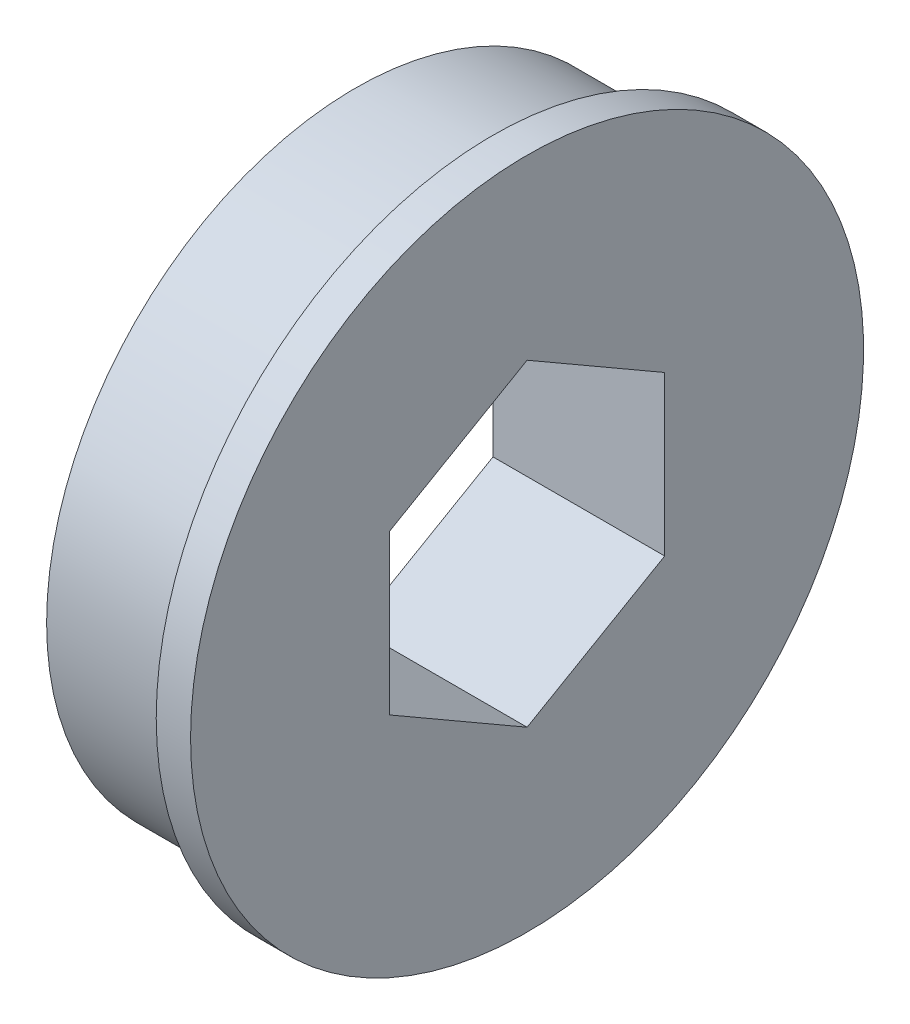
ISO-10303-21;
HEADER;
FILE_DESCRIPTION(('STEP AP214'),'2;1');
FILE_NAME('part.step','',(''),(''),'','','');
FILE_SCHEMA(('AUTOMOTIVE_DESIGN { 1 0 10303 214 1 1 1 1 }'));
ENDSEC;
DATA;
#1=APPLICATION_CONTEXT('core data for automotive mechanical design processes');
#2=APPLICATION_PROTOCOL_DEFINITION('international standard','automotive_design',2000,#1);
#3=PRODUCT_CONTEXT('',#1,'mechanical');
#4=PRODUCT('Part','Part','',(#3));
#5=PRODUCT_RELATED_PRODUCT_CATEGORY('part','',(#4));
#6=PRODUCT_DEFINITION_FORMATION('','',#4);
#7=PRODUCT_DEFINITION_CONTEXT('part definition',#1,'design');
#8=PRODUCT_DEFINITION('design','',#6,#7);
#9=PRODUCT_DEFINITION_SHAPE('','',#8);
#10=(LENGTH_UNIT() NAMED_UNIT(*) SI_UNIT(.MILLI.,.METRE.));
#11=(NAMED_UNIT(*) PLANE_ANGLE_UNIT() SI_UNIT($,.RADIAN.));
#12=(NAMED_UNIT(*) SI_UNIT($,.STERADIAN.) SOLID_ANGLE_UNIT());
#13=UNCERTAINTY_MEASURE_WITH_UNIT(LENGTH_MEASURE(1.E-05),#10,'distance_accuracy_value','');
#14=(GEOMETRIC_REPRESENTATION_CONTEXT(3) GLOBAL_UNCERTAINTY_ASSIGNED_CONTEXT((#13)) GLOBAL_UNIT_ASSIGNED_CONTEXT((#10,
#11,#12)) REPRESENTATION_CONTEXT('',''));
#15=CARTESIAN_POINT('',(0.,0.,0.));
#16=DIRECTION('',(0.,0.,1.));
#17=DIRECTION('',(1.,0.,0.));
#18=AXIS2_PLACEMENT_3D('',#15,#16,#17);
#19=CARTESIAN_POINT('',(-1.5875,0.,0.));
#20=DIRECTION('',(1.,0.,0.));
#21=DIRECTION('',(0.,0.,-1.));
#22=AXIS2_PLACEMENT_3D('',#19,#20,#21);
#23=PLANE('',#22);
#24=CARTESIAN_POINT('',(-1.5875,0.,0.));
#25=DIRECTION('',(-1.,0.,0.));
#26=DIRECTION('',(0.,0.,1.));
#27=AXIS2_PLACEMENT_3D('',#24,#25,#26);
#28=CIRCLE('',#27,14.2748);
#29=CARTESIAN_POINT('',(-1.5875,0.,14.2748));
#30=VERTEX_POINT('',#29);
#31=EDGE_CURVE('E11',#30,#30,#28,.T.);
#32=ORIENTED_EDGE('',*,*,#31,.T.);
#33=EDGE_LOOP('',(#32));
#34=FACE_BOUND('',#33,.T.);
#35=DIRECTION('',(0.,0.5,-0.866025403784439));
#36=VECTOR('',#35,1.);
#37=CARTESIAN_POINT('',(-1.5875,-5.51025983665925,-3.18135));
#38=LINE('',#37,#36);
#39=CARTESIAN_POINT('',(-1.5875,-7.34701311554566,0.));
#40=VERTEX_POINT('',#39);
#41=CARTESIAN_POINT('',(-1.5875,-3.67350655777283,-6.3627));
#42=VERTEX_POINT('',#41);
#43=EDGE_CURVE('E149',#40,#42,#38,.T.);
#44=ORIENTED_EDGE('',*,*,#43,.T.);
#45=DIRECTION('',(0.,1.,0.));
#46=VECTOR('',#45,1.);
#47=CARTESIAN_POINT('',(-1.5875,0.,-6.3627));
#48=LINE('',#47,#46);
#49=CARTESIAN_POINT('',(-1.5875,3.67350655777283,-6.3627));
#50=VERTEX_POINT('',#49);
#51=EDGE_CURVE('E152',#42,#50,#48,.T.);
#52=ORIENTED_EDGE('',*,*,#51,.T.);
#53=DIRECTION('',(0.,0.5,0.866025403784439));
#54=VECTOR('',#53,1.);
#55=CARTESIAN_POINT('',(-1.5875,5.51025983665925,-3.18135));
#56=LINE('',#55,#54);
#57=CARTESIAN_POINT('',(-1.5875,7.34701311554566,0.));
#58=VERTEX_POINT('',#57);
#59=EDGE_CURVE('E139',#50,#58,#56,.T.);
#60=ORIENTED_EDGE('',*,*,#59,.T.);
#61=DIRECTION('',(0.,-0.5,0.866025403784439));
#62=VECTOR('',#61,1.);
#63=CARTESIAN_POINT('',(-1.5875,5.51025983665925,3.18135));
#64=LINE('',#63,#62);
#65=CARTESIAN_POINT('',(-1.5875,3.67350655777283,6.3627));
#66=VERTEX_POINT('',#65);
#67=EDGE_CURVE('E110',#58,#66,#64,.T.);
#68=ORIENTED_EDGE('',*,*,#67,.T.);
#69=DIRECTION('',(0.,-1.,0.));
#70=VECTOR('',#69,1.);
#71=CARTESIAN_POINT('',(-1.5875,0.,6.3627));
#72=LINE('',#71,#70);
#73=CARTESIAN_POINT('',(-1.5875,-3.67350655777283,6.3627));
#74=VERTEX_POINT('',#73);
#75=EDGE_CURVE('E143',#66,#74,#72,.T.);
#76=ORIENTED_EDGE('',*,*,#75,.T.);
#77=DIRECTION('',(0.,-0.5,-0.866025403784439));
#78=VECTOR('',#77,1.);
#79=CARTESIAN_POINT('',(-1.5875,-5.51025983665925,3.18135));
#80=LINE('',#79,#78);
#81=EDGE_CURVE('E146',#74,#40,#80,.T.);
#82=ORIENTED_EDGE('',*,*,#81,.T.);
#83=EDGE_LOOP('',(#44,#52,#60,#68,#76,#82));
#84=FACE_BOUND('',#83,.T.);
#85=ADVANCED_FACE('F45',(#34,#84),#23,.F.);
#86=CARTESIAN_POINT('',(6.35,0.,0.));
#87=DIRECTION('',(-1.,0.,0.));
#88=DIRECTION('',(0.,0.,1.));
#89=AXIS2_PLACEMENT_3D('',#86,#87,#88);
#90=PLANE('',#89);
#91=CARTESIAN_POINT('',(6.35,0.,0.));
#92=DIRECTION('',(-1.,0.,0.));
#93=DIRECTION('',(0.,0.,1.));
#94=AXIS2_PLACEMENT_3D('',#91,#92,#93);
#95=CIRCLE('',#94,15.5575);
#96=CARTESIAN_POINT('',(6.35,0.,15.5575));
#97=VERTEX_POINT('',#96);
#98=EDGE_CURVE('E53',#97,#97,#95,.T.);
#99=ORIENTED_EDGE('',*,*,#98,.F.);
#100=EDGE_LOOP('',(#99));
#101=FACE_BOUND('',#100,.T.);
#102=DIRECTION('',(0.,0.5,0.866025403784439));
#103=VECTOR('',#102,1.);
#104=CARTESIAN_POINT('',(6.35,3.67350655777283,-6.3627));
#105=LINE('',#104,#103);
#106=CARTESIAN_POINT('',(6.35,3.67350655777283,-6.3627));
#107=VERTEX_POINT('',#106);
#108=CARTESIAN_POINT('',(6.35,7.34701311554567,0.));
#109=VERTEX_POINT('',#108);
#110=EDGE_CURVE('E112',#107,#109,#105,.T.);
#111=ORIENTED_EDGE('',*,*,#110,.F.);
#112=DIRECTION('',(0.,1.,0.));
#113=VECTOR('',#112,1.);
#114=CARTESIAN_POINT('',(6.35,-3.67350655777283,-6.3627));
#115=LINE('',#114,#113);
#116=CARTESIAN_POINT('',(6.35,-3.67350655777283,-6.3627));
#117=VERTEX_POINT('',#116);
#118=EDGE_CURVE('E68',#117,#107,#115,.T.);
#119=ORIENTED_EDGE('',*,*,#118,.F.);
#120=DIRECTION('',(0.,0.5,-0.866025403784439));
#121=VECTOR('',#120,1.);
#122=CARTESIAN_POINT('',(6.35,-7.34701311554566,0.));
#123=LINE('',#122,#121);
#124=CARTESIAN_POINT('',(6.35,-7.34701311554566,0.));
#125=VERTEX_POINT('',#124);
#126=EDGE_CURVE('E136',#125,#117,#123,.T.);
#127=ORIENTED_EDGE('',*,*,#126,.F.);
#128=DIRECTION('',(0.,-0.5,-0.866025403784439));
#129=VECTOR('',#128,1.);
#130=CARTESIAN_POINT('',(6.35,-3.67350655777283,6.3627));
#131=LINE('',#130,#129);
#132=CARTESIAN_POINT('',(6.35,-3.67350655777283,6.3627));
#133=VERTEX_POINT('',#132);
#134=EDGE_CURVE('E279',#133,#125,#131,.T.);
#135=ORIENTED_EDGE('',*,*,#134,.F.);
#136=DIRECTION('',(0.,-1.,0.));
#137=VECTOR('',#136,1.);
#138=CARTESIAN_POINT('',(6.35,3.67350655777283,6.3627));
#139=LINE('',#138,#137);
#140=CARTESIAN_POINT('',(6.35,3.67350655777283,6.3627));
#141=VERTEX_POINT('',#140);
#142=EDGE_CURVE('E123',#141,#133,#139,.T.);
#143=ORIENTED_EDGE('',*,*,#142,.F.);
#144=DIRECTION('',(0.,-0.5,0.866025403784439));
#145=VECTOR('',#144,1.);
#146=CARTESIAN_POINT('',(6.35,7.34701311554567,0.));
#147=LINE('',#146,#145);
#148=EDGE_CURVE('E107',#109,#141,#147,.T.);
#149=ORIENTED_EDGE('',*,*,#148,.F.);
#150=EDGE_LOOP('',(#111,#119,#127,#135,#143,#149));
#151=FACE_BOUND('',#150,.T.);
#152=ADVANCED_FACE('F120',(#101,#151),#90,.F.);
#153=CARTESIAN_POINT('',(-6.35,0.,0.));
#154=DIRECTION('',(-1.,0.,0.));
#155=DIRECTION('',(0.,0.,1.));
#156=AXIS2_PLACEMENT_3D('',#153,#154,#155);
#157=CYLINDRICAL_SURFACE('',#156,14.2748);
#158=ORIENTED_EDGE('',*,*,#31,.F.);
#159=EDGE_LOOP('',(#158));
#160=FACE_BOUND('',#159,.T.);
#161=CARTESIAN_POINT('',(4.7625,0.,0.));
#162=DIRECTION('',(-1.,0.,0.));
#163=DIRECTION('',(0.,0.,1.));
#164=AXIS2_PLACEMENT_3D('',#161,#162,#163);
#165=CIRCLE('',#164,14.2748);
#166=CARTESIAN_POINT('',(4.7625,0.,14.2748));
#167=VERTEX_POINT('',#166);
#168=EDGE_CURVE('E155',#167,#167,#165,.T.);
#169=ORIENTED_EDGE('',*,*,#168,.T.);
#170=EDGE_LOOP('',(#169));
#171=FACE_BOUND('',#170,.T.);
#172=ADVANCED_FACE('F47',(#160,#171),#157,.T.);
#173=CARTESIAN_POINT('',(-6.35,0.,0.));
#174=DIRECTION('',(-1.,0.,0.));
#175=DIRECTION('',(0.,0.,1.));
#176=AXIS2_PLACEMENT_3D('',#173,#174,#175);
#177=CYLINDRICAL_SURFACE('',#176,15.5575);
#178=CARTESIAN_POINT('',(4.7625,0.,0.));
#179=DIRECTION('',(-1.,0.,0.));
#180=DIRECTION('',(0.,0.,1.));
#181=AXIS2_PLACEMENT_3D('',#178,#179,#180);
#182=CIRCLE('',#181,15.5575);
#183=CARTESIAN_POINT('',(4.7625,0.,15.5575));
#184=VERTEX_POINT('',#183);
#185=EDGE_CURVE('E158',#184,#184,#182,.T.);
#186=ORIENTED_EDGE('',*,*,#185,.F.);
#187=EDGE_LOOP('',(#186));
#188=FACE_BOUND('',#187,.T.);
#189=ORIENTED_EDGE('',*,*,#98,.T.);
#190=EDGE_LOOP('',(#189));
#191=FACE_BOUND('',#190,.T.);
#192=ADVANCED_FACE('F163',(#188,#191),#177,.T.);
#193=CARTESIAN_POINT('',(4.7625,0.,0.));
#194=DIRECTION('',(1.,0.,0.));
#195=DIRECTION('',(0.,0.,-1.));
#196=AXIS2_PLACEMENT_3D('',#193,#194,#195);
#197=PLANE('',#196);
#198=ORIENTED_EDGE('',*,*,#168,.F.);
#199=EDGE_LOOP('',(#198));
#200=FACE_BOUND('',#199,.T.);
#201=ORIENTED_EDGE('',*,*,#185,.T.);
#202=EDGE_LOOP('',(#201));
#203=FACE_BOUND('',#202,.T.);
#204=ADVANCED_FACE('F176',(#200,#203),#197,.F.);
#205=CARTESIAN_POINT('',(-6.35,-3.67350655777283,-6.3627));
#206=DIRECTION('',(0.,0.,-1.));
#207=DIRECTION('',(0.,-1.,0.));
#208=AXIS2_PLACEMENT_3D('',#205,#206,#207);
#209=PLANE('',#208);
#210=ORIENTED_EDGE('',*,*,#51,.F.);
#211=DIRECTION('',(1.,0.,0.));
#212=VECTOR('',#211,1.);
#213=CARTESIAN_POINT('',(-6.35,-3.67350655777283,-6.3627));
#214=LINE('',#213,#212);
#215=EDGE_CURVE('E135',#42,#117,#214,.T.);
#216=ORIENTED_EDGE('',*,*,#215,.T.);
#217=ORIENTED_EDGE('',*,*,#118,.T.);
#218=DIRECTION('',(1.,0.,0.));
#219=VECTOR('',#218,1.);
#220=CARTESIAN_POINT('',(-6.35,3.67350655777283,-6.3627));
#221=LINE('',#220,#219);
#222=EDGE_CURVE('E116',#50,#107,#221,.T.);
#223=ORIENTED_EDGE('',*,*,#222,.F.);
#224=EDGE_LOOP('',(#210,#216,#217,#223));
#225=FACE_BOUND('',#224,.T.);
#226=ADVANCED_FACE('F180',(#225),#209,.F.);
#227=CARTESIAN_POINT('',(-6.35,-7.34701311554566,0.));
#228=DIRECTION('',(0.,-0.866025403784439,-0.5));
#229=DIRECTION('',(0.,0.5,-0.866025403784439));
#230=AXIS2_PLACEMENT_3D('',#227,#228,#229);
#231=PLANE('',#230);
#232=ORIENTED_EDGE('',*,*,#43,.F.);
#233=DIRECTION('',(1.,0.,0.));
#234=VECTOR('',#233,1.);
#235=CARTESIAN_POINT('',(-6.35,-7.34701311554566,0.));
#236=LINE('',#235,#234);
#237=EDGE_CURVE('E131',#40,#125,#236,.T.);
#238=ORIENTED_EDGE('',*,*,#237,.T.);
#239=ORIENTED_EDGE('',*,*,#126,.T.);
#240=ORIENTED_EDGE('',*,*,#215,.F.);
#241=EDGE_LOOP('',(#232,#238,#239,#240));
#242=FACE_BOUND('',#241,.T.);
#243=ADVANCED_FACE('F184',(#242),#231,.F.);
#244=CARTESIAN_POINT('',(-6.35,-3.67350655777283,6.3627));
#245=DIRECTION('',(0.,-0.866025403784439,0.5));
#246=DIRECTION('',(-1.,0.,0.));
#247=AXIS2_PLACEMENT_3D('',#244,#245,#246);
#248=PLANE('',#247);
#249=ORIENTED_EDGE('',*,*,#81,.F.);
#250=DIRECTION('',(1.,0.,0.));
#251=VECTOR('',#250,1.);
#252=CARTESIAN_POINT('',(-6.35,-3.67350655777283,6.3627));
#253=LINE('',#252,#251);
#254=EDGE_CURVE('E272',#74,#133,#253,.T.);
#255=ORIENTED_EDGE('',*,*,#254,.T.);
#256=ORIENTED_EDGE('',*,*,#134,.T.);
#257=ORIENTED_EDGE('',*,*,#237,.F.);
#258=EDGE_LOOP('',(#249,#255,#256,#257));
#259=FACE_BOUND('',#258,.T.);
#260=ADVANCED_FACE('F187',(#259),#248,.F.);
#261=CARTESIAN_POINT('',(-6.35,3.67350655777283,6.3627));
#262=DIRECTION('',(0.,0.,1.));
#263=DIRECTION('',(1.,0.,0.));
#264=AXIS2_PLACEMENT_3D('',#261,#262,#263);
#265=PLANE('',#264);
#266=ORIENTED_EDGE('',*,*,#75,.F.);
#267=DIRECTION('',(1.,0.,0.));
#268=VECTOR('',#267,1.);
#269=CARTESIAN_POINT('',(-6.35,3.67350655777283,6.3627));
#270=LINE('',#269,#268);
#271=EDGE_CURVE('E125',#66,#141,#270,.T.);
#272=ORIENTED_EDGE('',*,*,#271,.T.);
#273=ORIENTED_EDGE('',*,*,#142,.T.);
#274=ORIENTED_EDGE('',*,*,#254,.F.);
#275=EDGE_LOOP('',(#266,#272,#273,#274));
#276=FACE_BOUND('',#275,.T.);
#277=ADVANCED_FACE('F191',(#276),#265,.F.);
#278=CARTESIAN_POINT('',(-6.35,7.34701311554567,0.));
#279=DIRECTION('',(0.,0.866025403784439,0.5));
#280=DIRECTION('',(1.,0.,0.));
#281=AXIS2_PLACEMENT_3D('',#278,#279,#280);
#282=PLANE('',#281);
#283=ORIENTED_EDGE('',*,*,#67,.F.);
#284=DIRECTION('',(1.,0.,0.));
#285=VECTOR('',#284,1.);
#286=CARTESIAN_POINT('',(-6.35,7.34701311554567,0.));
#287=LINE('',#286,#285);
#288=EDGE_CURVE('E60',#58,#109,#287,.T.);
#289=ORIENTED_EDGE('',*,*,#288,.T.);
#290=ORIENTED_EDGE('',*,*,#148,.T.);
#291=ORIENTED_EDGE('',*,*,#271,.F.);
#292=EDGE_LOOP('',(#283,#289,#290,#291));
#293=FACE_BOUND('',#292,.T.);
#294=ADVANCED_FACE('F104',(#293),#282,.F.);
#295=CARTESIAN_POINT('',(-6.35,3.67350655777283,-6.3627));
#296=DIRECTION('',(0.,0.866025403784439,-0.5));
#297=DIRECTION('',(-1.,0.,0.));
#298=AXIS2_PLACEMENT_3D('',#295,#296,#297);
#299=PLANE('',#298);
#300=ORIENTED_EDGE('',*,*,#59,.F.);
#301=ORIENTED_EDGE('',*,*,#222,.T.);
#302=ORIENTED_EDGE('',*,*,#110,.T.);
#303=ORIENTED_EDGE('',*,*,#288,.F.);
#304=EDGE_LOOP('',(#300,#301,#302,#303));
#305=FACE_BOUND('',#304,.T.);
#306=ADVANCED_FACE('F115',(#305),#299,.F.);
#307=CLOSED_SHELL('',(#85,#152,#172,#192,#204,#226,#243,#260,#277,#294,#306));
#308=MANIFOLD_SOLID_BREP('B2',#307);
#309=ADVANCED_BREP_SHAPE_REPRESENTATION('',(#18,#308),#14);
#310=SHAPE_DEFINITION_REPRESENTATION(#9,#309);
ENDSEC;
END-ISO-10303-21;
